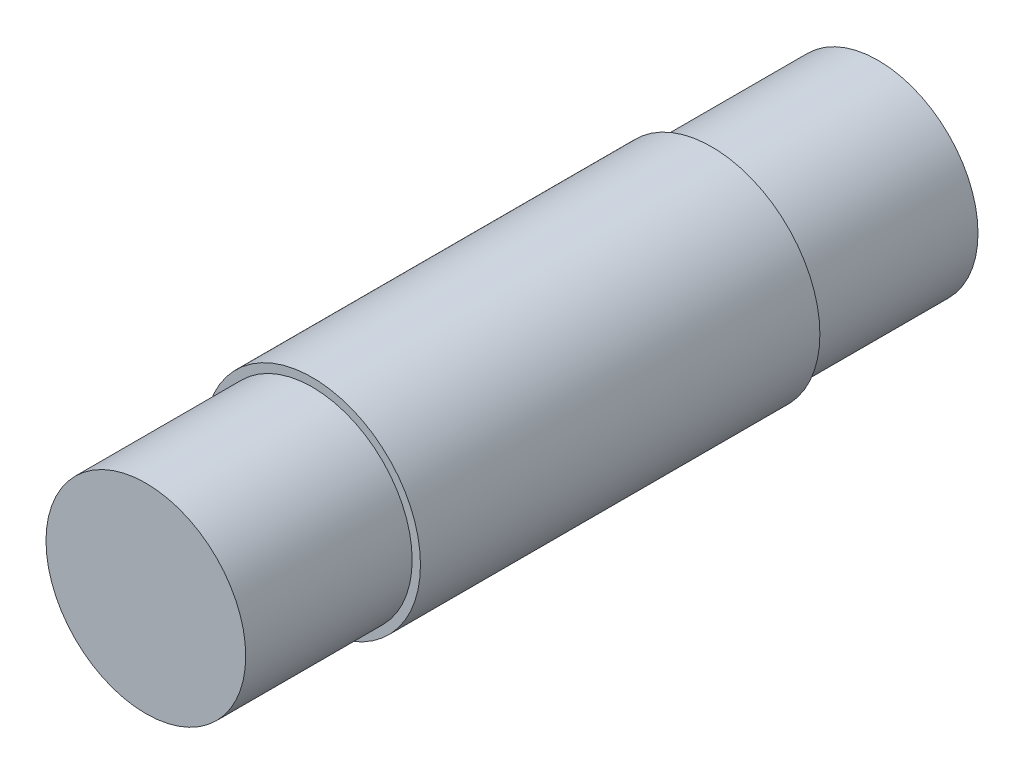
ISO-10303-21;
HEADER;
FILE_DESCRIPTION(('STEP AP214'),'2;1');
FILE_NAME('part.step','',(''),(''),'','','');
FILE_SCHEMA(('AUTOMOTIVE_DESIGN { 1 0 10303 214 1 1 1 1 }'));
ENDSEC;
DATA;
#1=APPLICATION_CONTEXT('core data for automotive mechanical design processes');
#2=APPLICATION_PROTOCOL_DEFINITION('international standard','automotive_design',2000,#1);
#3=PRODUCT_CONTEXT('',#1,'mechanical');
#4=PRODUCT('Part','Part','',(#3));
#5=PRODUCT_RELATED_PRODUCT_CATEGORY('part','',(#4));
#6=PRODUCT_DEFINITION_FORMATION('','',#4);
#7=PRODUCT_DEFINITION_CONTEXT('part definition',#1,'design');
#8=PRODUCT_DEFINITION('design','',#6,#7);
#9=PRODUCT_DEFINITION_SHAPE('','',#8);
#10=(LENGTH_UNIT() NAMED_UNIT(*) SI_UNIT(.MILLI.,.METRE.));
#11=(NAMED_UNIT(*) PLANE_ANGLE_UNIT() SI_UNIT($,.RADIAN.));
#12=(NAMED_UNIT(*) SI_UNIT($,.STERADIAN.) SOLID_ANGLE_UNIT());
#13=UNCERTAINTY_MEASURE_WITH_UNIT(LENGTH_MEASURE(1.E-05),#10,'distance_accuracy_value','');
#14=(GEOMETRIC_REPRESENTATION_CONTEXT(3) GLOBAL_UNCERTAINTY_ASSIGNED_CONTEXT((#13)) GLOBAL_UNIT_ASSIGNED_CONTEXT((#10,
#11,#12)) REPRESENTATION_CONTEXT('',''));
#15=CARTESIAN_POINT('',(0.,0.,0.));
#16=DIRECTION('',(0.,0.,1.));
#17=DIRECTION('',(1.,0.,0.));
#18=AXIS2_PLACEMENT_3D('',#15,#16,#17);
#19=CARTESIAN_POINT('',(0.,0.,5.));
#20=DIRECTION('',(0.,0.,-1.));
#21=DIRECTION('',(-1.,0.,0.));
#22=AXIS2_PLACEMENT_3D('',#19,#20,#21);
#23=CYLINDRICAL_SURFACE('',#22,3.);
#24=CARTESIAN_POINT('',(0.,0.,5.));
#25=DIRECTION('',(0.,0.,1.));
#26=DIRECTION('',(1.,0.,0.));
#27=AXIS2_PLACEMENT_3D('',#24,#25,#26);
#28=CIRCLE('',#27,3.);
#29=CARTESIAN_POINT('',(3.,0.,5.));
#30=VERTEX_POINT('',#29);
#31=EDGE_CURVE('E46',#30,#30,#28,.T.);
#32=ORIENTED_EDGE('',*,*,#31,.F.);
#33=EDGE_LOOP('',(#32));
#34=FACE_BOUND('',#33,.T.);
#35=CARTESIAN_POINT('',(0.,0.,0.));
#36=DIRECTION('',(0.,0.,1.));
#37=DIRECTION('',(1.,0.,0.));
#38=AXIS2_PLACEMENT_3D('',#35,#36,#37);
#39=CIRCLE('',#38,3.);
#40=CARTESIAN_POINT('',(3.,0.,0.));
#41=VERTEX_POINT('',#40);
#42=EDGE_CURVE('E42',#41,#41,#39,.T.);
#43=ORIENTED_EDGE('',*,*,#42,.T.);
#44=EDGE_LOOP('',(#43));
#45=FACE_BOUND('',#44,.T.);
#46=ADVANCED_FACE('F39',(#34,#45),#23,.T.);
#47=CARTESIAN_POINT('',(0.,0.,0.));
#48=DIRECTION('',(0.,0.,1.));
#49=DIRECTION('',(1.,0.,0.));
#50=AXIS2_PLACEMENT_3D('',#47,#48,#49);
#51=PLANE('',#50);
#52=ORIENTED_EDGE('',*,*,#42,.F.);
#53=EDGE_LOOP('',(#52));
#54=FACE_BOUND('',#53,.T.);
#55=ADVANCED_FACE('F81',(#54),#51,.F.);
#56=CARTESIAN_POINT('',(0.,0.,17.));
#57=DIRECTION('',(0.,0.,-1.));
#58=DIRECTION('',(-1.,0.,0.));
#59=AXIS2_PLACEMENT_3D('',#56,#57,#58);
#60=CYLINDRICAL_SURFACE('',#59,3.25);
#61=CARTESIAN_POINT('',(0.,0.,17.));
#62=DIRECTION('',(0.,0.,1.));
#63=DIRECTION('',(1.,0.,0.));
#64=AXIS2_PLACEMENT_3D('',#61,#62,#63);
#65=CIRCLE('',#64,3.25);
#66=CARTESIAN_POINT('',(3.25,0.,17.));
#67=VERTEX_POINT('',#66);
#68=EDGE_CURVE('E54',#67,#67,#65,.T.);
#69=ORIENTED_EDGE('',*,*,#68,.F.);
#70=EDGE_LOOP('',(#69));
#71=FACE_BOUND('',#70,.T.);
#72=CARTESIAN_POINT('',(0.,0.,5.));
#73=DIRECTION('',(0.,0.,1.));
#74=DIRECTION('',(1.,0.,0.));
#75=AXIS2_PLACEMENT_3D('',#72,#73,#74);
#76=CIRCLE('',#75,3.25);
#77=CARTESIAN_POINT('',(3.25,0.,5.));
#78=VERTEX_POINT('',#77);
#79=EDGE_CURVE('E57',#78,#78,#76,.T.);
#80=ORIENTED_EDGE('',*,*,#79,.T.);
#81=EDGE_LOOP('',(#80));
#82=FACE_BOUND('',#81,.T.);
#83=ADVANCED_FACE('F86',(#71,#82),#60,.T.);
#84=CARTESIAN_POINT('',(0.,0.,17.));
#85=DIRECTION('',(0.,0.,1.));
#86=DIRECTION('',(1.,0.,0.));
#87=AXIS2_PLACEMENT_3D('',#84,#85,#86);
#88=PLANE('',#87);
#89=CARTESIAN_POINT('',(0.,0.,17.));
#90=DIRECTION('',(0.,0.,1.));
#91=DIRECTION('',(1.,0.,0.));
#92=AXIS2_PLACEMENT_3D('',#89,#90,#91);
#93=CIRCLE('',#92,3.);
#94=CARTESIAN_POINT('',(3.,0.,17.));
#95=VERTEX_POINT('',#94);
#96=EDGE_CURVE('E10',#95,#95,#93,.T.);
#97=ORIENTED_EDGE('',*,*,#96,.F.);
#98=EDGE_LOOP('',(#97));
#99=FACE_BOUND('',#98,.T.);
#100=ORIENTED_EDGE('',*,*,#68,.T.);
#101=EDGE_LOOP('',(#100));
#102=FACE_BOUND('',#101,.T.);
#103=ADVANCED_FACE('F76',(#99,#102),#88,.T.);
#104=CARTESIAN_POINT('',(0.,0.,5.));
#105=DIRECTION('',(0.,0.,1.));
#106=DIRECTION('',(1.,0.,0.));
#107=AXIS2_PLACEMENT_3D('',#104,#105,#106);
#108=PLANE('',#107);
#109=ORIENTED_EDGE('',*,*,#31,.T.);
#110=EDGE_LOOP('',(#109));
#111=FACE_BOUND('',#110,.T.);
#112=ORIENTED_EDGE('',*,*,#79,.F.);
#113=EDGE_LOOP('',(#112));
#114=FACE_BOUND('',#113,.T.);
#115=ADVANCED_FACE('F68',(#111,#114),#108,.F.);
#116=CARTESIAN_POINT('',(0.,0.,22.));
#117=DIRECTION('',(0.,0.,-1.));
#118=DIRECTION('',(-1.,0.,0.));
#119=AXIS2_PLACEMENT_3D('',#116,#117,#118);
#120=CYLINDRICAL_SURFACE('',#119,3.);
#121=CARTESIAN_POINT('',(0.,0.,22.));
#122=DIRECTION('',(0.,0.,1.));
#123=DIRECTION('',(1.,0.,0.));
#124=AXIS2_PLACEMENT_3D('',#121,#122,#123);
#125=CIRCLE('',#124,3.);
#126=CARTESIAN_POINT('',(3.,0.,22.));
#127=VERTEX_POINT('',#126);
#128=EDGE_CURVE('E53',#127,#127,#125,.T.);
#129=ORIENTED_EDGE('',*,*,#128,.F.);
#130=EDGE_LOOP('',(#129));
#131=FACE_BOUND('',#130,.T.);
#132=ORIENTED_EDGE('',*,*,#96,.T.);
#133=EDGE_LOOP('',(#132));
#134=FACE_BOUND('',#133,.T.);
#135=ADVANCED_FACE('F66',(#131,#134),#120,.T.);
#136=CARTESIAN_POINT('',(0.,0.,22.));
#137=DIRECTION('',(0.,0.,1.));
#138=DIRECTION('',(1.,0.,0.));
#139=AXIS2_PLACEMENT_3D('',#136,#137,#138);
#140=PLANE('',#139);
#141=ORIENTED_EDGE('',*,*,#128,.T.);
#142=EDGE_LOOP('',(#141));
#143=FACE_BOUND('',#142,.T.);
#144=ADVANCED_FACE('F64',(#143),#140,.T.);
#145=CLOSED_SHELL('',(#46,#55,#83,#103,#115,#135,#144));
#146=MANIFOLD_SOLID_BREP('B2',#145);
#147=ADVANCED_BREP_SHAPE_REPRESENTATION('',(#18,#146),#14);
#148=SHAPE_DEFINITION_REPRESENTATION(#9,#147);
ENDSEC;
END-ISO-10303-21;
